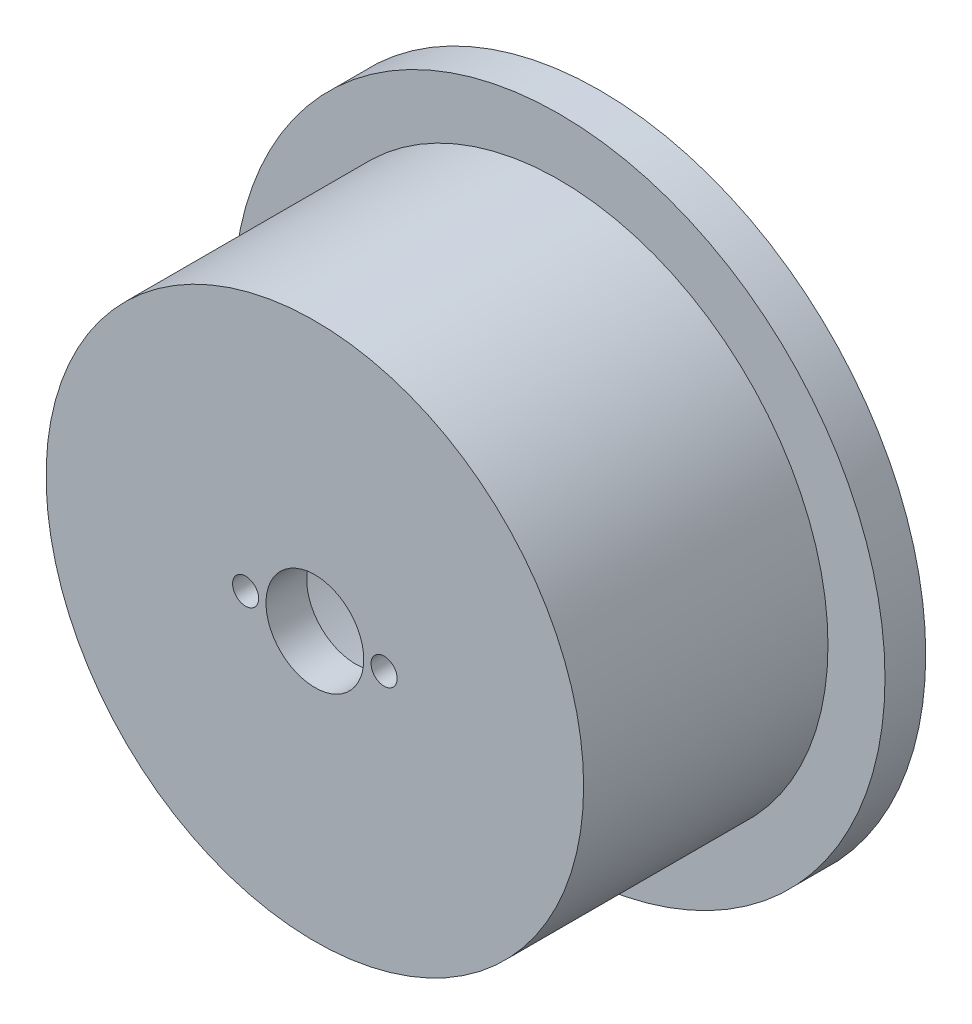
ISO-10303-21;
HEADER;
FILE_DESCRIPTION(('STEP AP214'),'2;1');
FILE_NAME('part.step','',(''),(''),'','','');
FILE_SCHEMA(('AUTOMOTIVE_DESIGN { 1 0 10303 214 1 1 1 1 }'));
ENDSEC;
DATA;
#1=APPLICATION_CONTEXT('core data for automotive mechanical design processes');
#2=APPLICATION_PROTOCOL_DEFINITION('international standard','automotive_design',2000,#1);
#3=PRODUCT_CONTEXT('',#1,'mechanical');
#4=PRODUCT('Part','Part','',(#3));
#5=PRODUCT_RELATED_PRODUCT_CATEGORY('part','',(#4));
#6=PRODUCT_DEFINITION_FORMATION('','',#4);
#7=PRODUCT_DEFINITION_CONTEXT('part definition',#1,'design');
#8=PRODUCT_DEFINITION('design','',#6,#7);
#9=PRODUCT_DEFINITION_SHAPE('','',#8);
#10=(LENGTH_UNIT() NAMED_UNIT(*) SI_UNIT(.MILLI.,.METRE.));
#11=(NAMED_UNIT(*) PLANE_ANGLE_UNIT() SI_UNIT($,.RADIAN.));
#12=(NAMED_UNIT(*) SI_UNIT($,.STERADIAN.) SOLID_ANGLE_UNIT());
#13=UNCERTAINTY_MEASURE_WITH_UNIT(LENGTH_MEASURE(1.E-05),#10,'distance_accuracy_value','');
#14=(GEOMETRIC_REPRESENTATION_CONTEXT(3) GLOBAL_UNCERTAINTY_ASSIGNED_CONTEXT((#13)) GLOBAL_UNIT_ASSIGNED_CONTEXT((#10,
#11,#12)) REPRESENTATION_CONTEXT('',''));
#15=CARTESIAN_POINT('',(0.,0.,0.));
#16=DIRECTION('',(0.,0.,1.));
#17=DIRECTION('',(1.,0.,0.));
#18=AXIS2_PLACEMENT_3D('',#15,#16,#17);
#19=CARTESIAN_POINT('',(0.,0.,5.));
#20=DIRECTION('',(0.,0.,1.));
#21=DIRECTION('',(1.,0.,0.));
#22=AXIS2_PLACEMENT_3D('',#19,#20,#21);
#23=PLANE('',#22);
#24=CARTESIAN_POINT('',(0.,0.,5.));
#25=DIRECTION('',(0.,0.,1.));
#26=DIRECTION('',(1.,0.,0.));
#27=AXIS2_PLACEMENT_3D('',#24,#25,#26);
#28=CIRCLE('',#27,40.);
#29=CARTESIAN_POINT('',(40.,0.,5.));
#30=VERTEX_POINT('',#29);
#31=EDGE_CURVE('E10',#30,#30,#28,.T.);
#32=ORIENTED_EDGE('',*,*,#31,.T.);
#33=EDGE_LOOP('',(#32));
#34=FACE_BOUND('',#33,.T.);
#35=CARTESIAN_POINT('',(0.,0.,5.));
#36=DIRECTION('',(0.,0.,1.));
#37=DIRECTION('',(1.,0.,0.));
#38=AXIS2_PLACEMENT_3D('',#35,#36,#37);
#39=CIRCLE('',#38,33.);
#40=CARTESIAN_POINT('',(33.,0.,5.));
#41=VERTEX_POINT('',#40);
#42=EDGE_CURVE('E52',#41,#41,#39,.T.);
#43=ORIENTED_EDGE('',*,*,#42,.F.);
#44=EDGE_LOOP('',(#43));
#45=FACE_BOUND('',#44,.T.);
#46=ADVANCED_FACE('F37',(#34,#45),#23,.T.);
#47=CARTESIAN_POINT('',(0.,0.,0.));
#48=DIRECTION('',(0.,0.,1.));
#49=DIRECTION('',(1.,0.,0.));
#50=AXIS2_PLACEMENT_3D('',#47,#48,#49);
#51=PLANE('',#50);
#52=CARTESIAN_POINT('',(21.2132034355964,-21.2132034355964,0.));
#53=DIRECTION('',(0.,0.,1.));
#54=DIRECTION('',(1.,0.,0.));
#55=AXIS2_PLACEMENT_3D('',#52,#53,#54);
#56=CIRCLE('',#55,1.7);
#57=CARTESIAN_POINT('',(22.9132034355964,-21.2132034355964,0.));
#58=VERTEX_POINT('',#57);
#59=EDGE_CURVE('E89',#58,#58,#56,.T.);
#60=ORIENTED_EDGE('',*,*,#59,.T.);
#61=EDGE_LOOP('',(#60));
#62=FACE_BOUND('',#61,.T.);
#63=CARTESIAN_POINT('',(-21.2132034355964,-21.2132034355964,0.));
#64=DIRECTION('',(0.,0.,1.));
#65=DIRECTION('',(1.,0.,0.));
#66=AXIS2_PLACEMENT_3D('',#63,#64,#65);
#67=CIRCLE('',#66,1.7);
#68=CARTESIAN_POINT('',(-19.5132034355964,-21.2132034355964,0.));
#69=VERTEX_POINT('',#68);
#70=EDGE_CURVE('E95',#69,#69,#67,.T.);
#71=ORIENTED_EDGE('',*,*,#70,.T.);
#72=EDGE_LOOP('',(#71));
#73=FACE_BOUND('',#72,.T.);
#74=CARTESIAN_POINT('',(-21.2132034355964,21.2132034355964,0.));
#75=DIRECTION('',(0.,0.,1.));
#76=DIRECTION('',(1.,0.,0.));
#77=AXIS2_PLACEMENT_3D('',#74,#75,#76);
#78=CIRCLE('',#77,1.7);
#79=CARTESIAN_POINT('',(-19.5132034355964,21.2132034355964,0.));
#80=VERTEX_POINT('',#79);
#81=EDGE_CURVE('E83',#80,#80,#78,.T.);
#82=ORIENTED_EDGE('',*,*,#81,.T.);
#83=EDGE_LOOP('',(#82));
#84=FACE_BOUND('',#83,.T.);
#85=CARTESIAN_POINT('',(21.2132034355964,21.2132034355964,0.));
#86=DIRECTION('',(0.,0.,1.));
#87=DIRECTION('',(1.,0.,0.));
#88=AXIS2_PLACEMENT_3D('',#85,#86,#87);
#89=CIRCLE('',#88,1.7);
#90=CARTESIAN_POINT('',(22.9132034355964,21.2132034355964,0.));
#91=VERTEX_POINT('',#90);
#92=EDGE_CURVE('E80',#91,#91,#89,.T.);
#93=ORIENTED_EDGE('',*,*,#92,.T.);
#94=EDGE_LOOP('',(#93));
#95=FACE_BOUND('',#94,.T.);
#96=CARTESIAN_POINT('',(0.,0.,0.));
#97=DIRECTION('',(0.,0.,1.));
#98=DIRECTION('',(1.,0.,0.));
#99=AXIS2_PLACEMENT_3D('',#96,#97,#98);
#100=CIRCLE('',#99,40.);
#101=CARTESIAN_POINT('',(40.,0.,0.));
#102=VERTEX_POINT('',#101);
#103=EDGE_CURVE('E41',#102,#102,#100,.T.);
#104=ORIENTED_EDGE('',*,*,#103,.F.);
#105=EDGE_LOOP('',(#104));
#106=FACE_BOUND('',#105,.T.);
#107=CARTESIAN_POINT('',(0.,0.,0.));
#108=DIRECTION('',(0.,0.,1.));
#109=DIRECTION('',(1.,0.,0.));
#110=AXIS2_PLACEMENT_3D('',#107,#108,#109);
#111=CIRCLE('',#110,28.);
#112=CARTESIAN_POINT('',(28.,0.,0.));
#113=VERTEX_POINT('',#112);
#114=EDGE_CURVE('E48',#113,#113,#111,.T.);
#115=ORIENTED_EDGE('',*,*,#114,.T.);
#116=EDGE_LOOP('',(#115));
#117=FACE_BOUND('',#116,.T.);
#118=ADVANCED_FACE('F104',(#62,#73,#84,#95,#106,#117),#51,.F.);
#119=CARTESIAN_POINT('',(0.,0.,5.));
#120=DIRECTION('',(0.,0.,-1.));
#121=DIRECTION('',(-1.,0.,0.));
#122=AXIS2_PLACEMENT_3D('',#119,#120,#121);
#123=CYLINDRICAL_SURFACE('',#122,40.);
#124=ORIENTED_EDGE('',*,*,#31,.F.);
#125=EDGE_LOOP('',(#124));
#126=FACE_BOUND('',#125,.T.);
#127=ORIENTED_EDGE('',*,*,#103,.T.);
#128=EDGE_LOOP('',(#127));
#129=FACE_BOUND('',#128,.T.);
#130=ADVANCED_FACE('F39',(#126,#129),#123,.T.);
#131=CARTESIAN_POINT('',(0.,0.,5.));
#132=DIRECTION('',(0.,0.,-1.));
#133=DIRECTION('',(-1.,0.,0.));
#134=AXIS2_PLACEMENT_3D('',#131,#132,#133);
#135=CYLINDRICAL_SURFACE('',#134,28.);
#136=ORIENTED_EDGE('',*,*,#114,.F.);
#137=EDGE_LOOP('',(#136));
#138=FACE_BOUND('',#137,.T.);
#139=CARTESIAN_POINT('',(0.,0.,30.));
#140=DIRECTION('',(0.,0.,1.));
#141=DIRECTION('',(1.,0.,0.));
#142=AXIS2_PLACEMENT_3D('',#139,#140,#141);
#143=CIRCLE('',#142,28.);
#144=CARTESIAN_POINT('',(28.,0.,30.));
#145=VERTEX_POINT('',#144);
#146=EDGE_CURVE('E55',#145,#145,#143,.T.);
#147=ORIENTED_EDGE('',*,*,#146,.T.);
#148=EDGE_LOOP('',(#147));
#149=FACE_BOUND('',#148,.T.);
#150=ADVANCED_FACE('F133',(#138,#149),#135,.F.);
#151=CARTESIAN_POINT('',(0.,0.,30.));
#152=DIRECTION('',(0.,0.,-1.));
#153=DIRECTION('',(-1.,0.,0.));
#154=AXIS2_PLACEMENT_3D('',#151,#152,#153);
#155=CYLINDRICAL_SURFACE('',#154,33.);
#156=ORIENTED_EDGE('',*,*,#42,.T.);
#157=EDGE_LOOP('',(#156));
#158=FACE_BOUND('',#157,.T.);
#159=CARTESIAN_POINT('',(0.,0.,35.));
#160=DIRECTION('',(0.,0.,1.));
#161=DIRECTION('',(1.,0.,0.));
#162=AXIS2_PLACEMENT_3D('',#159,#160,#161);
#163=CIRCLE('',#162,33.);
#164=CARTESIAN_POINT('',(33.,0.,35.));
#165=VERTEX_POINT('',#164);
#166=EDGE_CURVE('E58',#165,#165,#163,.T.);
#167=ORIENTED_EDGE('',*,*,#166,.F.);
#168=EDGE_LOOP('',(#167));
#169=FACE_BOUND('',#168,.T.);
#170=ADVANCED_FACE('F135',(#158,#169),#155,.T.);
#171=CARTESIAN_POINT('',(0.,0.,30.));
#172=DIRECTION('',(0.,0.,1.));
#173=DIRECTION('',(1.,0.,0.));
#174=AXIS2_PLACEMENT_3D('',#171,#172,#173);
#175=PLANE('',#174);
#176=CARTESIAN_POINT('',(-8.5,0.,30.));
#177=DIRECTION('',(0.,0.,1.));
#178=DIRECTION('',(1.,0.,0.));
#179=AXIS2_PLACEMENT_3D('',#176,#177,#178);
#180=CIRCLE('',#179,1.6);
#181=CARTESIAN_POINT('',(-6.9,0.,30.));
#182=VERTEX_POINT('',#181);
#183=EDGE_CURVE('E75',#182,#182,#180,.T.);
#184=ORIENTED_EDGE('',*,*,#183,.T.);
#185=EDGE_LOOP('',(#184));
#186=FACE_BOUND('',#185,.T.);
#187=CARTESIAN_POINT('',(8.5,0.,30.));
#188=DIRECTION('',(0.,0.,1.));
#189=DIRECTION('',(1.,0.,0.));
#190=AXIS2_PLACEMENT_3D('',#187,#188,#189);
#191=CIRCLE('',#190,1.6);
#192=CARTESIAN_POINT('',(10.1,0.,30.));
#193=VERTEX_POINT('',#192);
#194=EDGE_CURVE('E71',#193,#193,#191,.T.);
#195=ORIENTED_EDGE('',*,*,#194,.T.);
#196=EDGE_LOOP('',(#195));
#197=FACE_BOUND('',#196,.T.);
#198=CARTESIAN_POINT('',(0.,0.,30.));
#199=DIRECTION('',(0.,0.,1.));
#200=DIRECTION('',(1.,0.,0.));
#201=AXIS2_PLACEMENT_3D('',#198,#199,#200);
#202=CIRCLE('',#201,6.);
#203=CARTESIAN_POINT('',(6.,0.,30.));
#204=VERTEX_POINT('',#203);
#205=EDGE_CURVE('E62',#204,#204,#202,.T.);
#206=ORIENTED_EDGE('',*,*,#205,.T.);
#207=EDGE_LOOP('',(#206));
#208=FACE_BOUND('',#207,.T.);
#209=ORIENTED_EDGE('',*,*,#146,.F.);
#210=EDGE_LOOP('',(#209));
#211=FACE_BOUND('',#210,.T.);
#212=ADVANCED_FACE('F139',(#186,#197,#208,#211),#175,.F.);
#213=CARTESIAN_POINT('',(0.,0.,35.));
#214=DIRECTION('',(0.,0.,1.));
#215=DIRECTION('',(1.,0.,0.));
#216=AXIS2_PLACEMENT_3D('',#213,#214,#215);
#217=PLANE('',#216);
#218=CARTESIAN_POINT('',(-8.5,0.,35.));
#219=DIRECTION('',(0.,0.,1.));
#220=DIRECTION('',(1.,0.,0.));
#221=AXIS2_PLACEMENT_3D('',#218,#219,#220);
#222=CIRCLE('',#221,1.6);
#223=CARTESIAN_POINT('',(-6.9,0.,35.));
#224=VERTEX_POINT('',#223);
#225=EDGE_CURVE('E65',#224,#224,#222,.T.);
#226=ORIENTED_EDGE('',*,*,#225,.F.);
#227=EDGE_LOOP('',(#226));
#228=FACE_BOUND('',#227,.T.);
#229=CARTESIAN_POINT('',(8.5,0.,35.));
#230=DIRECTION('',(0.,0.,1.));
#231=DIRECTION('',(1.,0.,0.));
#232=AXIS2_PLACEMENT_3D('',#229,#230,#231);
#233=CIRCLE('',#232,1.6);
#234=CARTESIAN_POINT('',(10.1,0.,35.));
#235=VERTEX_POINT('',#234);
#236=EDGE_CURVE('E68',#235,#235,#233,.T.);
#237=ORIENTED_EDGE('',*,*,#236,.F.);
#238=EDGE_LOOP('',(#237));
#239=FACE_BOUND('',#238,.T.);
#240=CARTESIAN_POINT('',(0.,0.,35.));
#241=DIRECTION('',(0.,0.,1.));
#242=DIRECTION('',(1.,0.,0.));
#243=AXIS2_PLACEMENT_3D('',#240,#241,#242);
#244=CIRCLE('',#243,6.);
#245=CARTESIAN_POINT('',(6.,0.,35.));
#246=VERTEX_POINT('',#245);
#247=EDGE_CURVE('E61',#246,#246,#244,.T.);
#248=ORIENTED_EDGE('',*,*,#247,.F.);
#249=EDGE_LOOP('',(#248));
#250=FACE_BOUND('',#249,.T.);
#251=ORIENTED_EDGE('',*,*,#166,.T.);
#252=EDGE_LOOP('',(#251));
#253=FACE_BOUND('',#252,.T.);
#254=ADVANCED_FACE('F143',(#228,#239,#250,#253),#217,.T.);
#255=CARTESIAN_POINT('',(0.,0.,35.));
#256=DIRECTION('',(0.,0.,-1.));
#257=DIRECTION('',(-1.,0.,0.));
#258=AXIS2_PLACEMENT_3D('',#255,#256,#257);
#259=CYLINDRICAL_SURFACE('',#258,6.);
#260=ORIENTED_EDGE('',*,*,#247,.T.);
#261=EDGE_LOOP('',(#260));
#262=FACE_BOUND('',#261,.T.);
#263=ORIENTED_EDGE('',*,*,#205,.F.);
#264=EDGE_LOOP('',(#263));
#265=FACE_BOUND('',#264,.T.);
#266=ADVANCED_FACE('F147',(#262,#265),#259,.F.);
#267=CARTESIAN_POINT('',(8.5,0.,35.));
#268=DIRECTION('',(0.,0.,-1.));
#269=DIRECTION('',(-1.,0.,0.));
#270=AXIS2_PLACEMENT_3D('',#267,#268,#269);
#271=CYLINDRICAL_SURFACE('',#270,1.6);
#272=ORIENTED_EDGE('',*,*,#236,.T.);
#273=EDGE_LOOP('',(#272));
#274=FACE_BOUND('',#273,.T.);
#275=ORIENTED_EDGE('',*,*,#194,.F.);
#276=EDGE_LOOP('',(#275));
#277=FACE_BOUND('',#276,.T.);
#278=ADVANCED_FACE('F151',(#274,#277),#271,.F.);
#279=CARTESIAN_POINT('',(-8.5,0.,35.));
#280=DIRECTION('',(0.,0.,-1.));
#281=DIRECTION('',(-1.,0.,0.));
#282=AXIS2_PLACEMENT_3D('',#279,#280,#281);
#283=CYLINDRICAL_SURFACE('',#282,1.6);
#284=ORIENTED_EDGE('',*,*,#225,.T.);
#285=EDGE_LOOP('',(#284));
#286=FACE_BOUND('',#285,.T.);
#287=ORIENTED_EDGE('',*,*,#183,.F.);
#288=EDGE_LOOP('',(#287));
#289=FACE_BOUND('',#288,.T.);
#290=ADVANCED_FACE('F155',(#286,#289),#283,.F.);
#291=CARTESIAN_POINT('',(21.2132034355964,21.2132034355964,5.));
#292=DIRECTION('',(0.,0.,-1.));
#293=DIRECTION('',(-1.,0.,0.));
#294=AXIS2_PLACEMENT_3D('',#291,#292,#293);
#295=CYLINDRICAL_SURFACE('',#294,1.7);
#296=CARTESIAN_POINT('',(21.2132034355964,21.2132034355964,5.));
#297=DIRECTION('',(0.,0.,1.));
#298=DIRECTION('',(1.,0.,0.));
#299=AXIS2_PLACEMENT_3D('',#296,#297,#298);
#300=CIRCLE('',#299,1.7);
#301=CARTESIAN_POINT('',(22.9132034355964,21.2132034355964,5.));
#302=VERTEX_POINT('',#301);
#303=EDGE_CURVE('E72',#302,#302,#300,.T.);
#304=ORIENTED_EDGE('',*,*,#303,.T.);
#305=EDGE_LOOP('',(#304));
#306=FACE_BOUND('',#305,.T.);
#307=ORIENTED_EDGE('',*,*,#92,.F.);
#308=EDGE_LOOP('',(#307));
#309=FACE_BOUND('',#308,.T.);
#310=ADVANCED_FACE('F120',(#306,#309),#295,.F.);
#311=CARTESIAN_POINT('',(21.2132034355964,21.2132034355964,5.));
#312=DIRECTION('',(0.,0.,1.));
#313=DIRECTION('',(1.,0.,0.));
#314=AXIS2_PLACEMENT_3D('',#311,#312,#313);
#315=PLANE('',#314);
#316=ORIENTED_EDGE('',*,*,#303,.F.);
#317=EDGE_LOOP('',(#316));
#318=FACE_BOUND('',#317,.T.);
#319=ADVANCED_FACE('F110',(#318),#315,.F.);
#320=CARTESIAN_POINT('',(-21.2132034355964,21.2132034355964,5.));
#321=DIRECTION('',(0.,0.,-1.));
#322=DIRECTION('',(-1.,0.,0.));
#323=AXIS2_PLACEMENT_3D('',#320,#321,#322);
#324=CYLINDRICAL_SURFACE('',#323,1.7);
#325=CARTESIAN_POINT('',(-21.2132034355964,21.2132034355964,5.));
#326=DIRECTION('',(0.,0.,1.));
#327=DIRECTION('',(1.,0.,0.));
#328=AXIS2_PLACEMENT_3D('',#325,#326,#327);
#329=CIRCLE('',#328,1.7);
#330=CARTESIAN_POINT('',(-19.5132034355964,21.2132034355964,5.));
#331=VERTEX_POINT('',#330);
#332=EDGE_CURVE('E98',#331,#331,#329,.T.);
#333=ORIENTED_EDGE('',*,*,#332,.T.);
#334=EDGE_LOOP('',(#333));
#335=FACE_BOUND('',#334,.T.);
#336=ORIENTED_EDGE('',*,*,#81,.F.);
#337=EDGE_LOOP('',(#336));
#338=FACE_BOUND('',#337,.T.);
#339=ADVANCED_FACE('F107',(#335,#338),#324,.F.);
#340=CARTESIAN_POINT('',(-21.2132034355964,21.2132034355964,5.));
#341=DIRECTION('',(0.,0.,1.));
#342=DIRECTION('',(1.,0.,0.));
#343=AXIS2_PLACEMENT_3D('',#340,#341,#342);
#344=PLANE('',#343);
#345=ORIENTED_EDGE('',*,*,#332,.F.);
#346=EDGE_LOOP('',(#345));
#347=FACE_BOUND('',#346,.T.);
#348=ADVANCED_FACE('F109',(#347),#344,.F.);
#349=CARTESIAN_POINT('',(-21.2132034355964,-21.2132034355964,5.));
#350=DIRECTION('',(0.,0.,-1.));
#351=DIRECTION('',(-1.,0.,0.));
#352=AXIS2_PLACEMENT_3D('',#349,#350,#351);
#353=CYLINDRICAL_SURFACE('',#352,1.7);
#354=CARTESIAN_POINT('',(-21.2132034355964,-21.2132034355964,5.));
#355=DIRECTION('',(0.,0.,1.));
#356=DIRECTION('',(1.,0.,0.));
#357=AXIS2_PLACEMENT_3D('',#354,#355,#356);
#358=CIRCLE('',#357,1.7);
#359=CARTESIAN_POINT('',(-19.5132034355964,-21.2132034355964,5.));
#360=VERTEX_POINT('',#359);
#361=EDGE_CURVE('E92',#360,#360,#358,.T.);
#362=ORIENTED_EDGE('',*,*,#361,.T.);
#363=EDGE_LOOP('',(#362));
#364=FACE_BOUND('',#363,.T.);
#365=ORIENTED_EDGE('',*,*,#70,.F.);
#366=EDGE_LOOP('',(#365));
#367=FACE_BOUND('',#366,.T.);
#368=ADVANCED_FACE('F117',(#364,#367),#353,.F.);
#369=CARTESIAN_POINT('',(-21.2132034355964,-21.2132034355964,5.));
#370=DIRECTION('',(0.,0.,1.));
#371=DIRECTION('',(1.,0.,0.));
#372=AXIS2_PLACEMENT_3D('',#369,#370,#371);
#373=PLANE('',#372);
#374=ORIENTED_EDGE('',*,*,#361,.F.);
#375=EDGE_LOOP('',(#374));
#376=FACE_BOUND('',#375,.T.);
#377=ADVANCED_FACE('F170',(#376),#373,.F.);
#378=CARTESIAN_POINT('',(21.2132034355964,-21.2132034355964,5.));
#379=DIRECTION('',(0.,0.,-1.));
#380=DIRECTION('',(-1.,0.,0.));
#381=AXIS2_PLACEMENT_3D('',#378,#379,#380);
#382=CYLINDRICAL_SURFACE('',#381,1.7);
#383=CARTESIAN_POINT('',(21.2132034355964,-21.2132034355964,5.));
#384=DIRECTION('',(0.,0.,1.));
#385=DIRECTION('',(1.,0.,0.));
#386=AXIS2_PLACEMENT_3D('',#383,#384,#385);
#387=CIRCLE('',#386,1.7);
#388=CARTESIAN_POINT('',(22.9132034355964,-21.2132034355964,5.));
#389=VERTEX_POINT('',#388);
#390=EDGE_CURVE('E86',#389,#389,#387,.T.);
#391=ORIENTED_EDGE('',*,*,#390,.T.);
#392=EDGE_LOOP('',(#391));
#393=FACE_BOUND('',#392,.T.);
#394=ORIENTED_EDGE('',*,*,#59,.F.);
#395=EDGE_LOOP('',(#394));
#396=FACE_BOUND('',#395,.T.);
#397=ADVANCED_FACE('F166',(#393,#396),#382,.F.);
#398=CARTESIAN_POINT('',(21.2132034355964,-21.2132034355964,5.));
#399=DIRECTION('',(0.,0.,1.));
#400=DIRECTION('',(1.,0.,0.));
#401=AXIS2_PLACEMENT_3D('',#398,#399,#400);
#402=PLANE('',#401);
#403=ORIENTED_EDGE('',*,*,#390,.F.);
#404=EDGE_LOOP('',(#403));
#405=FACE_BOUND('',#404,.T.);
#406=ADVANCED_FACE('F163',(#405),#402,.F.);
#407=CLOSED_SHELL('',(#46,#118,#130,#150,#170,#212,#254,#266,#278,#290,#310,#319,#339,#348,#368,
#377,#397,#406));
#408=MANIFOLD_SOLID_BREP('B2',#407);
#409=ADVANCED_BREP_SHAPE_REPRESENTATION('',(#18,#408),#14);
#410=SHAPE_DEFINITION_REPRESENTATION(#9,#409);
ENDSEC;
END-ISO-10303-21;
